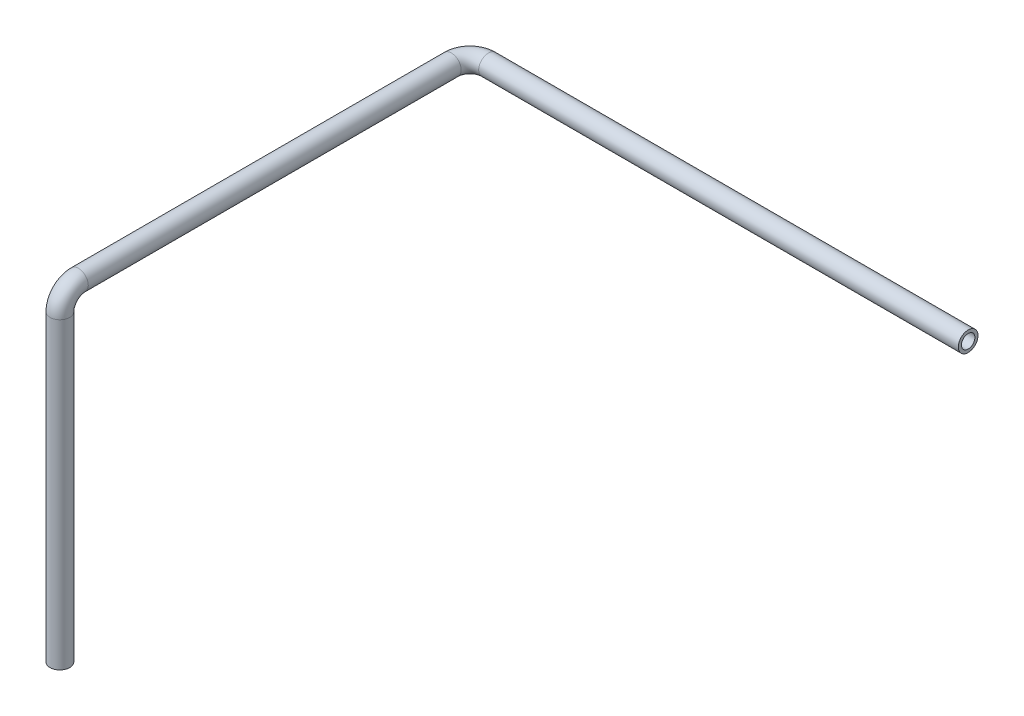
ISO-10303-21;
HEADER;
FILE_DESCRIPTION(('STEP AP214'),'2;1');
FILE_NAME('part.step','',(''),(''),'','','');
FILE_SCHEMA(('AUTOMOTIVE_DESIGN { 1 0 10303 214 1 1 1 1 }'));
ENDSEC;
DATA;
#1=APPLICATION_CONTEXT('core data for automotive mechanical design processes');
#2=APPLICATION_PROTOCOL_DEFINITION('international standard','automotive_design',2000,#1);
#3=PRODUCT_CONTEXT('',#1,'mechanical');
#4=PRODUCT('Part','Part','',(#3));
#5=PRODUCT_RELATED_PRODUCT_CATEGORY('part','',(#4));
#6=PRODUCT_DEFINITION_FORMATION('','',#4);
#7=PRODUCT_DEFINITION_CONTEXT('part definition',#1,'design');
#8=PRODUCT_DEFINITION('design','',#6,#7);
#9=PRODUCT_DEFINITION_SHAPE('','',#8);
#10=(LENGTH_UNIT() NAMED_UNIT(*) SI_UNIT(.MILLI.,.METRE.));
#11=(NAMED_UNIT(*) PLANE_ANGLE_UNIT() SI_UNIT($,.RADIAN.));
#12=(NAMED_UNIT(*) SI_UNIT($,.STERADIAN.) SOLID_ANGLE_UNIT());
#13=UNCERTAINTY_MEASURE_WITH_UNIT(LENGTH_MEASURE(1.E-05),#10,'distance_accuracy_value','');
#14=(GEOMETRIC_REPRESENTATION_CONTEXT(3) GLOBAL_UNCERTAINTY_ASSIGNED_CONTEXT((#13)) GLOBAL_UNIT_ASSIGNED_CONTEXT((#10,
#11,#12)) REPRESENTATION_CONTEXT('',''));
#15=CARTESIAN_POINT('',(0.,0.,0.));
#16=DIRECTION('',(0.,0.,1.));
#17=DIRECTION('',(1.,0.,0.));
#18=AXIS2_PLACEMENT_3D('',#15,#16,#17);
#19=CARTESIAN_POINT('',(-150.,237.,200.));
#20=DIRECTION('',(0.,-1.,0.));
#21=DIRECTION('',(1.,0.,0.));
#22=AXIS2_PLACEMENT_3D('',#19,#20,#21);
#23=PLANE('',#22);
#24=CARTESIAN_POINT('',(-150.,237.,200.));
#25=DIRECTION('',(0.,-1.,0.));
#26=DIRECTION('',(1.,0.,0.));
#27=AXIS2_PLACEMENT_3D('',#24,#25,#26);
#28=CIRCLE('',#27,2.175);
#29=CARTESIAN_POINT('',(-147.825,237.,200.));
#30=VERTEX_POINT('',#29);
#31=EDGE_CURVE('E213',#30,#30,#28,.T.);
#32=ORIENTED_EDGE('',*,*,#31,.F.);
#33=EDGE_LOOP('',(#32));
#34=FACE_BOUND('',#33,.T.);
#35=CARTESIAN_POINT('',(-150.,237.,200.));
#36=DIRECTION('',(0.,-1.,0.));
#37=DIRECTION('',(0.,0.,-1.));
#38=AXIS2_PLACEMENT_3D('',#35,#36,#37);
#39=CIRCLE('',#38,3.175);
#40=CARTESIAN_POINT('',(-150.,237.,196.825));
#41=VERTEX_POINT('',#40);
#42=EDGE_CURVE('E75',#41,#41,#39,.T.);
#43=ORIENTED_EDGE('',*,*,#42,.T.);
#44=EDGE_LOOP('',(#43));
#45=FACE_BOUND('',#44,.T.);
#46=ADVANCED_FACE('F52',(#34,#45),#23,.T.);
#47=CARTESIAN_POINT('',(11.,341.,67.5));
#48=DIRECTION('',(-1.,0.,0.));
#49=DIRECTION('',(0.,0.,1.));
#50=AXIS2_PLACEMENT_3D('',#47,#48,#49);
#51=PLANE('',#50);
#52=CARTESIAN_POINT('',(11.,341.,67.5));
#53=DIRECTION('',(-1.,0.,0.));
#54=DIRECTION('',(0.,0.,1.));
#55=AXIS2_PLACEMENT_3D('',#52,#53,#54);
#56=CIRCLE('',#55,2.175);
#57=CARTESIAN_POINT('',(11.,341.,69.675));
#58=VERTEX_POINT('',#57);
#59=EDGE_CURVE('E73',#58,#58,#56,.T.);
#60=ORIENTED_EDGE('',*,*,#59,.T.);
#61=EDGE_LOOP('',(#60));
#62=FACE_BOUND('',#61,.T.);
#63=CARTESIAN_POINT('',(11.,341.,67.5));
#64=DIRECTION('',(-1.,0.,0.));
#65=DIRECTION('',(0.,0.,1.));
#66=AXIS2_PLACEMENT_3D('',#63,#64,#65);
#67=CIRCLE('',#66,3.175);
#68=CARTESIAN_POINT('',(11.,341.,70.675));
#69=VERTEX_POINT('',#68);
#70=EDGE_CURVE('E11',#69,#69,#67,.T.);
#71=ORIENTED_EDGE('',*,*,#70,.F.);
#72=EDGE_LOOP('',(#71));
#73=FACE_BOUND('',#72,.T.);
#74=ADVANCED_FACE('F132',(#62,#73),#51,.F.);
#75=CARTESIAN_POINT('',(-150.,237.,200.));
#76=DIRECTION('',(0.,1.,0.));
#77=DIRECTION('',(0.,0.,1.));
#78=AXIS2_PLACEMENT_3D('',#75,#76,#77);
#79=CYLINDRICAL_SURFACE('',#78,3.175);
#80=CARTESIAN_POINT('',(-150.,335.,200.));
#81=DIRECTION('',(0.,1.,0.));
#82=DIRECTION('',(0.,0.,1.));
#83=AXIS2_PLACEMENT_3D('',#80,#81,#82);
#84=CIRCLE('',#83,3.175);
#85=CARTESIAN_POINT('',(-150.,335.,203.175));
#86=VERTEX_POINT('',#85);
#87=EDGE_CURVE('E74',#86,#86,#84,.F.);
#88=ORIENTED_EDGE('',*,*,#87,.T.);
#89=EDGE_LOOP('',(#88));
#90=FACE_BOUND('',#89,.T.);
#91=ORIENTED_EDGE('',*,*,#42,.F.);
#92=EDGE_LOOP('',(#91));
#93=FACE_BOUND('',#92,.T.);
#94=ADVANCED_FACE('F102',(#90,#93),#79,.T.);
#95=CARTESIAN_POINT('',(-150.,335.,194.));
#96=DIRECTION('',(-1.,0.,0.));
#97=DIRECTION('',(0.,0.,1.));
#98=AXIS2_PLACEMENT_3D('',#95,#96,#97);
#99=TOROIDAL_SURFACE('',#98,6.00000000000001,3.175);
#100=CARTESIAN_POINT('',(-150.,341.,194.));
#101=DIRECTION('',(0.,0.,1.));
#102=DIRECTION('',(0.,-1.,0.));
#103=AXIS2_PLACEMENT_3D('',#100,#101,#102);
#104=CIRCLE('',#103,3.175);
#105=CARTESIAN_POINT('',(-150.,344.175,194.));
#106=VERTEX_POINT('',#105);
#107=EDGE_CURVE('E68',#106,#106,#104,.T.);
#108=CARTESIAN_POINT('',(-150.,335.,194.));
#109=DIRECTION('',(-1.,0.,0.));
#110=DIRECTION('',(0.,0.,1.));
#111=AXIS2_PLACEMENT_3D('',#108,#109,#110);
#112=CIRCLE('',#111,9.175);
#113=EDGE_CURVE('',#86,#106,#112,.T.);
#114=ORIENTED_EDGE('',*,*,#87,.F.);
#115=ORIENTED_EDGE('',*,*,#107,.T.);
#116=ORIENTED_EDGE('',*,*,#113,.T.);
#117=ORIENTED_EDGE('',*,*,#113,.F.);
#118=EDGE_LOOP('',(#114,#116,#115,#117));
#119=FACE_BOUND('',#118,.T.);
#120=ADVANCED_FACE('F95',(#119),#99,.T.);
#121=CARTESIAN_POINT('',(-150.,341.,194.));
#122=DIRECTION('',(0.,0.,-1.));
#123=DIRECTION('',(-1.,0.,0.));
#124=AXIS2_PLACEMENT_3D('',#121,#122,#123);
#125=CYLINDRICAL_SURFACE('',#124,3.175);
#126=CARTESIAN_POINT('',(-150.,341.,73.5));
#127=DIRECTION('',(0.,0.,-1.));
#128=DIRECTION('',(-1.,0.,0.));
#129=AXIS2_PLACEMENT_3D('',#126,#127,#128);
#130=CIRCLE('',#129,3.175);
#131=CARTESIAN_POINT('',(-153.175,341.,73.5));
#132=VERTEX_POINT('',#131);
#133=EDGE_CURVE('E63',#132,#132,#130,.F.);
#134=ORIENTED_EDGE('',*,*,#133,.T.);
#135=EDGE_LOOP('',(#134));
#136=FACE_BOUND('',#135,.T.);
#137=ORIENTED_EDGE('',*,*,#107,.F.);
#138=EDGE_LOOP('',(#137));
#139=FACE_BOUND('',#138,.T.);
#140=ADVANCED_FACE('F92',(#136,#139),#125,.T.);
#141=CARTESIAN_POINT('',(-144.,341.,73.5));
#142=DIRECTION('',(0.,-1.,0.));
#143=DIRECTION('',(0.,0.,-1.));
#144=AXIS2_PLACEMENT_3D('',#141,#142,#143);
#145=TOROIDAL_SURFACE('',#144,6.00000000000001,3.175);
#146=CARTESIAN_POINT('',(-144.,341.,67.5));
#147=DIRECTION('',(-1.,0.,0.));
#148=DIRECTION('',(0.,0.,1.));
#149=AXIS2_PLACEMENT_3D('',#146,#147,#148);
#150=CIRCLE('',#149,3.175);
#151=CARTESIAN_POINT('',(-144.,341.,64.325));
#152=VERTEX_POINT('',#151);
#153=EDGE_CURVE('E58',#152,#152,#150,.T.);
#154=CARTESIAN_POINT('',(-144.,341.,73.5));
#155=DIRECTION('',(0.,-1.,0.));
#156=DIRECTION('',(0.,0.,-1.));
#157=AXIS2_PLACEMENT_3D('',#154,#155,#156);
#158=CIRCLE('',#157,9.175);
#159=EDGE_CURVE('',#132,#152,#158,.T.);
#160=ORIENTED_EDGE('',*,*,#133,.F.);
#161=ORIENTED_EDGE('',*,*,#153,.T.);
#162=ORIENTED_EDGE('',*,*,#159,.T.);
#163=ORIENTED_EDGE('',*,*,#159,.F.);
#164=EDGE_LOOP('',(#160,#162,#161,#163));
#165=FACE_BOUND('',#164,.T.);
#166=ADVANCED_FACE('F100',(#165),#145,.T.);
#167=CARTESIAN_POINT('',(-144.,341.,67.5));
#168=DIRECTION('',(1.,0.,0.));
#169=DIRECTION('',(0.,0.,-1.));
#170=AXIS2_PLACEMENT_3D('',#167,#168,#169);
#171=CYLINDRICAL_SURFACE('',#170,3.175);
#172=ORIENTED_EDGE('',*,*,#70,.T.);
#173=EDGE_LOOP('',(#172));
#174=FACE_BOUND('',#173,.T.);
#175=ORIENTED_EDGE('',*,*,#153,.F.);
#176=EDGE_LOOP('',(#175));
#177=FACE_BOUND('',#176,.T.);
#178=ADVANCED_FACE('F54',(#174,#177),#171,.T.);
#179=CARTESIAN_POINT('',(-150.,237.,200.));
#180=DIRECTION('',(0.,1.,0.));
#181=DIRECTION('',(0.,0.,1.));
#182=AXIS2_PLACEMENT_3D('',#179,#180,#181);
#183=CYLINDRICAL_SURFACE('',#182,2.175);
#184=CARTESIAN_POINT('',(-150.,335.,200.));
#185=DIRECTION('',(0.,-1.,0.));
#186=DIRECTION('',(1.,0.,0.));
#187=AXIS2_PLACEMENT_3D('',#184,#185,#186);
#188=CIRCLE('',#187,2.175);
#189=CARTESIAN_POINT('',(-150.,335.,202.175));
#190=VERTEX_POINT('',#189);
#191=EDGE_CURVE('E212',#190,#190,#188,.T.);
#192=ORIENTED_EDGE('',*,*,#191,.F.);
#193=EDGE_LOOP('',(#192));
#194=FACE_BOUND('',#193,.T.);
#195=ORIENTED_EDGE('',*,*,#31,.T.);
#196=EDGE_LOOP('',(#195));
#197=FACE_BOUND('',#196,.T.);
#198=ADVANCED_FACE('F110',(#194,#197),#183,.F.);
#199=CARTESIAN_POINT('',(-150.,335.,194.));
#200=DIRECTION('',(-1.,0.,0.));
#201=DIRECTION('',(0.,0.,1.));
#202=AXIS2_PLACEMENT_3D('',#199,#200,#201);
#203=TOROIDAL_SURFACE('',#202,6.00000000000001,2.175);
#204=CARTESIAN_POINT('',(-150.,341.,194.));
#205=DIRECTION('',(0.,0.,1.));
#206=DIRECTION('',(1.,0.,0.));
#207=AXIS2_PLACEMENT_3D('',#204,#205,#206);
#208=CIRCLE('',#207,2.175);
#209=CARTESIAN_POINT('',(-150.,343.175,194.));
#210=VERTEX_POINT('',#209);
#211=EDGE_CURVE('E220',#210,#210,#208,.T.);
#212=CARTESIAN_POINT('',(-150.,335.,194.));
#213=DIRECTION('',(-1.,0.,0.));
#214=DIRECTION('',(0.,0.,1.));
#215=AXIS2_PLACEMENT_3D('',#212,#213,#214);
#216=CIRCLE('',#215,8.175);
#217=EDGE_CURVE('',#190,#210,#216,.T.);
#218=ORIENTED_EDGE('',*,*,#191,.T.);
#219=ORIENTED_EDGE('',*,*,#211,.F.);
#220=ORIENTED_EDGE('',*,*,#217,.T.);
#221=ORIENTED_EDGE('',*,*,#217,.F.);
#222=EDGE_LOOP('',(#218,#220,#219,#221));
#223=FACE_BOUND('',#222,.T.);
#224=ADVANCED_FACE('F112',(#223),#203,.F.);
#225=CARTESIAN_POINT('',(-150.,341.,194.));
#226=DIRECTION('',(0.,0.,-1.));
#227=DIRECTION('',(-1.,0.,0.));
#228=AXIS2_PLACEMENT_3D('',#225,#226,#227);
#229=CYLINDRICAL_SURFACE('',#228,2.175);
#230=CARTESIAN_POINT('',(-150.,341.,73.5));
#231=DIRECTION('',(0.,0.,1.));
#232=DIRECTION('',(1.,0.,0.));
#233=AXIS2_PLACEMENT_3D('',#230,#231,#232);
#234=CIRCLE('',#233,2.175);
#235=CARTESIAN_POINT('',(-152.175,341.,73.5));
#236=VERTEX_POINT('',#235);
#237=EDGE_CURVE('E88',#236,#236,#234,.T.);
#238=ORIENTED_EDGE('',*,*,#237,.F.);
#239=EDGE_LOOP('',(#238));
#240=FACE_BOUND('',#239,.T.);
#241=ORIENTED_EDGE('',*,*,#211,.T.);
#242=EDGE_LOOP('',(#241));
#243=FACE_BOUND('',#242,.T.);
#244=ADVANCED_FACE('F120',(#240,#243),#229,.F.);
#245=CARTESIAN_POINT('',(-144.,341.,73.5));
#246=DIRECTION('',(0.,-1.,0.));
#247=DIRECTION('',(0.,0.,-1.));
#248=AXIS2_PLACEMENT_3D('',#245,#246,#247);
#249=TOROIDAL_SURFACE('',#248,6.00000000000001,2.175);
#250=CARTESIAN_POINT('',(-144.,341.,67.5));
#251=DIRECTION('',(-1.,0.,0.));
#252=DIRECTION('',(0.,0.,1.));
#253=AXIS2_PLACEMENT_3D('',#250,#251,#252);
#254=CIRCLE('',#253,2.175);
#255=CARTESIAN_POINT('',(-144.,341.,65.325));
#256=VERTEX_POINT('',#255);
#257=EDGE_CURVE('E81',#256,#256,#254,.T.);
#258=CARTESIAN_POINT('',(-144.,341.,73.5));
#259=DIRECTION('',(0.,-1.,0.));
#260=DIRECTION('',(0.,0.,-1.));
#261=AXIS2_PLACEMENT_3D('',#258,#259,#260);
#262=CIRCLE('',#261,8.175);
#263=EDGE_CURVE('',#236,#256,#262,.T.);
#264=ORIENTED_EDGE('',*,*,#237,.T.);
#265=ORIENTED_EDGE('',*,*,#257,.F.);
#266=ORIENTED_EDGE('',*,*,#263,.T.);
#267=ORIENTED_EDGE('',*,*,#263,.F.);
#268=EDGE_LOOP('',(#264,#266,#265,#267));
#269=FACE_BOUND('',#268,.T.);
#270=ADVANCED_FACE('F127',(#269),#249,.F.);
#271=CARTESIAN_POINT('',(-144.,341.,67.5));
#272=DIRECTION('',(1.,0.,0.));
#273=DIRECTION('',(0.,0.,-1.));
#274=AXIS2_PLACEMENT_3D('',#271,#272,#273);
#275=CYLINDRICAL_SURFACE('',#274,2.175);
#276=ORIENTED_EDGE('',*,*,#59,.F.);
#277=EDGE_LOOP('',(#276));
#278=FACE_BOUND('',#277,.T.);
#279=ORIENTED_EDGE('',*,*,#257,.T.);
#280=EDGE_LOOP('',(#279));
#281=FACE_BOUND('',#280,.T.);
#282=ADVANCED_FACE('F128',(#278,#281),#275,.F.);
#283=CLOSED_SHELL('',(#46,#74,#94,#120,#140,#166,#178,#198,#224,#244,#270,#282));
#284=MANIFOLD_SOLID_BREP('B2',#283);
#285=ADVANCED_BREP_SHAPE_REPRESENTATION('',(#18,#284),#14);
#286=SHAPE_DEFINITION_REPRESENTATION(#9,#285);
ENDSEC;
END-ISO-10303-21;
